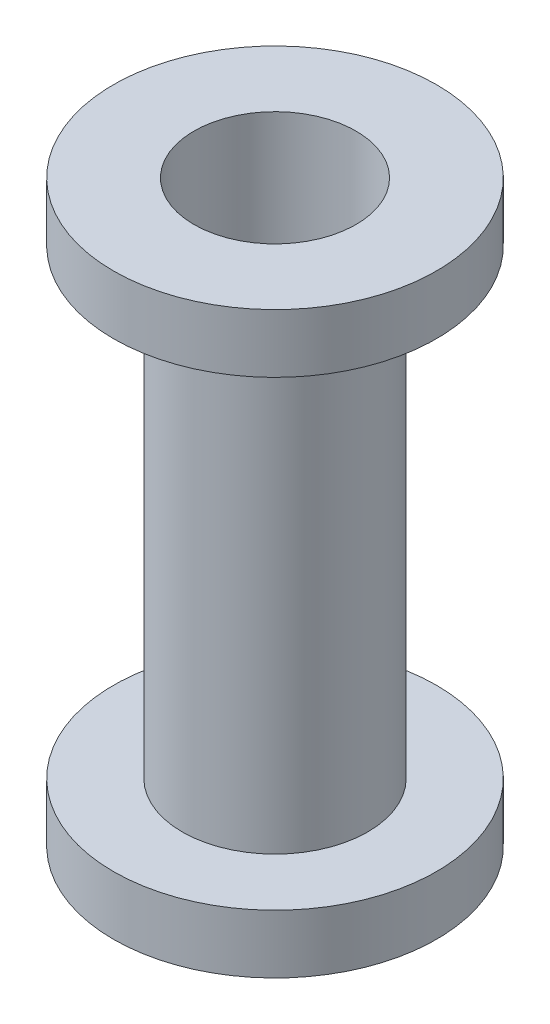
ISO-10303-21;
HEADER;
FILE_DESCRIPTION(('STEP AP214'),'2;1');
FILE_NAME('part.step','',(''),(''),'','','');
FILE_SCHEMA(('AUTOMOTIVE_DESIGN { 1 0 10303 214 1 1 1 1 }'));
ENDSEC;
DATA;
#1=APPLICATION_CONTEXT('core data for automotive mechanical design processes');
#2=APPLICATION_PROTOCOL_DEFINITION('international standard','automotive_design',2000,#1);
#3=PRODUCT_CONTEXT('',#1,'mechanical');
#4=PRODUCT('Part','Part','',(#3));
#5=PRODUCT_RELATED_PRODUCT_CATEGORY('part','',(#4));
#6=PRODUCT_DEFINITION_FORMATION('','',#4);
#7=PRODUCT_DEFINITION_CONTEXT('part definition',#1,'design');
#8=PRODUCT_DEFINITION('design','',#6,#7);
#9=PRODUCT_DEFINITION_SHAPE('','',#8);
#10=(LENGTH_UNIT() NAMED_UNIT(*) SI_UNIT(.MILLI.,.METRE.));
#11=(NAMED_UNIT(*) PLANE_ANGLE_UNIT() SI_UNIT($,.RADIAN.));
#12=(NAMED_UNIT(*) SI_UNIT($,.STERADIAN.) SOLID_ANGLE_UNIT());
#13=UNCERTAINTY_MEASURE_WITH_UNIT(LENGTH_MEASURE(1.E-05),#10,'distance_accuracy_value','');
#14=(GEOMETRIC_REPRESENTATION_CONTEXT(3) GLOBAL_UNCERTAINTY_ASSIGNED_CONTEXT((#13)) GLOBAL_UNIT_ASSIGNED_CONTEXT((#10,
#11,#12)) REPRESENTATION_CONTEXT('',''));
#15=CARTESIAN_POINT('',(0.,0.,0.));
#16=DIRECTION('',(0.,0.,1.));
#17=DIRECTION('',(1.,0.,0.));
#18=AXIS2_PLACEMENT_3D('',#15,#16,#17);
#19=CARTESIAN_POINT('',(0.,125.222,0.));
#20=DIRECTION('',(0.,-1.,0.));
#21=DIRECTION('',(0.,0.,-1.));
#22=AXIS2_PLACEMENT_3D('',#19,#20,#21);
#23=CYLINDRICAL_SURFACE('',#22,20.066);
#24=CARTESIAN_POINT('',(0.,112.522,0.));
#25=DIRECTION('',(0.,1.,0.));
#26=DIRECTION('',(0.,0.,1.));
#27=AXIS2_PLACEMENT_3D('',#24,#25,#26);
#28=CIRCLE('',#27,20.066);
#29=CARTESIAN_POINT('',(0.,112.522,20.066));
#30=VERTEX_POINT('',#29);
#31=EDGE_CURVE('E35',#30,#30,#28,.T.);
#32=ORIENTED_EDGE('',*,*,#31,.F.);
#33=EDGE_LOOP('',(#32));
#34=FACE_BOUND('',#33,.T.);
#35=CARTESIAN_POINT('',(0.,12.7,0.));
#36=DIRECTION('',(0.,-1.,0.));
#37=DIRECTION('',(0.,0.,-1.));
#38=AXIS2_PLACEMENT_3D('',#35,#36,#37);
#39=CIRCLE('',#38,20.066);
#40=CARTESIAN_POINT('',(0.,12.7,-20.066));
#41=VERTEX_POINT('',#40);
#42=EDGE_CURVE('E10',#41,#41,#39,.T.);
#43=ORIENTED_EDGE('',*,*,#42,.F.);
#44=EDGE_LOOP('',(#43));
#45=FACE_BOUND('',#44,.T.);
#46=ADVANCED_FACE('F28',(#34,#45),#23,.T.);
#47=CARTESIAN_POINT('',(0.,125.222,0.));
#48=DIRECTION('',(0.,1.,0.));
#49=DIRECTION('',(0.,0.,1.));
#50=AXIS2_PLACEMENT_3D('',#47,#48,#49);
#51=PLANE('',#50);
#52=CARTESIAN_POINT('',(0.,125.222,0.));
#53=DIRECTION('',(0.,1.,0.));
#54=DIRECTION('',(0.,0.,1.));
#55=AXIS2_PLACEMENT_3D('',#52,#53,#54);
#56=CIRCLE('',#55,17.526);
#57=CARTESIAN_POINT('',(0.,125.222,17.526));
#58=VERTEX_POINT('',#57);
#59=EDGE_CURVE('E40',#58,#58,#56,.T.);
#60=ORIENTED_EDGE('',*,*,#59,.F.);
#61=EDGE_LOOP('',(#60));
#62=FACE_BOUND('',#61,.T.);
#63=CARTESIAN_POINT('',(0.,125.222,0.));
#64=DIRECTION('',(0.,1.,0.));
#65=DIRECTION('',(0.,0.,1.));
#66=AXIS2_PLACEMENT_3D('',#63,#64,#65);
#67=CIRCLE('',#66,34.925);
#68=CARTESIAN_POINT('',(0.,125.222,34.925));
#69=VERTEX_POINT('',#68);
#70=EDGE_CURVE('E49',#69,#69,#67,.T.);
#71=ORIENTED_EDGE('',*,*,#70,.T.);
#72=EDGE_LOOP('',(#71));
#73=FACE_BOUND('',#72,.T.);
#74=ADVANCED_FACE('F72',(#62,#73),#51,.T.);
#75=CARTESIAN_POINT('',(0.,0.,0.));
#76=DIRECTION('',(0.,1.,0.));
#77=DIRECTION('',(0.,0.,1.));
#78=AXIS2_PLACEMENT_3D('',#75,#76,#77);
#79=PLANE('',#78);
#80=CARTESIAN_POINT('',(0.,0.,0.));
#81=DIRECTION('',(0.,1.,0.));
#82=DIRECTION('',(0.,0.,1.));
#83=AXIS2_PLACEMENT_3D('',#80,#81,#82);
#84=CIRCLE('',#83,17.526);
#85=CARTESIAN_POINT('',(0.,0.,17.526));
#86=VERTEX_POINT('',#85);
#87=EDGE_CURVE('E31',#86,#86,#84,.T.);
#88=ORIENTED_EDGE('',*,*,#87,.T.);
#89=EDGE_LOOP('',(#88));
#90=FACE_BOUND('',#89,.T.);
#91=CARTESIAN_POINT('',(0.,0.,0.));
#92=DIRECTION('',(0.,-1.,0.));
#93=DIRECTION('',(0.,0.,-1.));
#94=AXIS2_PLACEMENT_3D('',#91,#92,#93);
#95=CIRCLE('',#94,34.925);
#96=CARTESIAN_POINT('',(0.,0.,-34.925));
#97=VERTEX_POINT('',#96);
#98=EDGE_CURVE('E44',#97,#97,#95,.T.);
#99=ORIENTED_EDGE('',*,*,#98,.T.);
#100=EDGE_LOOP('',(#99));
#101=FACE_BOUND('',#100,.T.);
#102=ADVANCED_FACE('F58',(#90,#101),#79,.F.);
#103=CARTESIAN_POINT('',(0.,125.222,0.));
#104=DIRECTION('',(0.,-1.,0.));
#105=DIRECTION('',(0.,0.,-1.));
#106=AXIS2_PLACEMENT_3D('',#103,#104,#105);
#107=CYLINDRICAL_SURFACE('',#106,17.526);
#108=ORIENTED_EDGE('',*,*,#87,.F.);
#109=EDGE_LOOP('',(#108));
#110=FACE_BOUND('',#109,.T.);
#111=ORIENTED_EDGE('',*,*,#59,.T.);
#112=EDGE_LOOP('',(#111));
#113=FACE_BOUND('',#112,.T.);
#114=ADVANCED_FACE('F61',(#110,#113),#107,.F.);
#115=CARTESIAN_POINT('',(0.,112.522,0.));
#116=DIRECTION('',(0.,1.,0.));
#117=DIRECTION('',(0.,0.,1.));
#118=AXIS2_PLACEMENT_3D('',#115,#116,#117);
#119=PLANE('',#118);
#120=CARTESIAN_POINT('',(0.,112.522,0.));
#121=DIRECTION('',(0.,1.,0.));
#122=DIRECTION('',(0.,0.,1.));
#123=AXIS2_PLACEMENT_3D('',#120,#121,#122);
#124=CIRCLE('',#123,34.925);
#125=CARTESIAN_POINT('',(0.,112.522,34.925));
#126=VERTEX_POINT('',#125);
#127=EDGE_CURVE('E46',#126,#126,#124,.T.);
#128=ORIENTED_EDGE('',*,*,#127,.F.);
#129=EDGE_LOOP('',(#128));
#130=FACE_BOUND('',#129,.T.);
#131=ORIENTED_EDGE('',*,*,#31,.T.);
#132=EDGE_LOOP('',(#131));
#133=FACE_BOUND('',#132,.T.);
#134=ADVANCED_FACE('F63',(#130,#133),#119,.F.);
#135=CARTESIAN_POINT('',(0.,112.522,0.));
#136=DIRECTION('',(0.,1.,0.));
#137=DIRECTION('',(0.,0.,1.));
#138=AXIS2_PLACEMENT_3D('',#135,#136,#137);
#139=CYLINDRICAL_SURFACE('',#138,34.925);
#140=ORIENTED_EDGE('',*,*,#127,.T.);
#141=EDGE_LOOP('',(#140));
#142=FACE_BOUND('',#141,.T.);
#143=ORIENTED_EDGE('',*,*,#70,.F.);
#144=EDGE_LOOP('',(#143));
#145=FACE_BOUND('',#144,.T.);
#146=ADVANCED_FACE('F69',(#142,#145),#139,.T.);
#147=CARTESIAN_POINT('',(0.,12.7,0.));
#148=DIRECTION('',(0.,-1.,0.));
#149=DIRECTION('',(0.,0.,-1.));
#150=AXIS2_PLACEMENT_3D('',#147,#148,#149);
#151=PLANE('',#150);
#152=CARTESIAN_POINT('',(0.,12.7,0.));
#153=DIRECTION('',(0.,-1.,0.));
#154=DIRECTION('',(0.,0.,-1.));
#155=AXIS2_PLACEMENT_3D('',#152,#153,#154);
#156=CIRCLE('',#155,34.925);
#157=CARTESIAN_POINT('',(0.,12.7,-34.925));
#158=VERTEX_POINT('',#157);
#159=EDGE_CURVE('E51',#158,#158,#156,.T.);
#160=ORIENTED_EDGE('',*,*,#159,.F.);
#161=EDGE_LOOP('',(#160));
#162=FACE_BOUND('',#161,.T.);
#163=ORIENTED_EDGE('',*,*,#42,.T.);
#164=EDGE_LOOP('',(#163));
#165=FACE_BOUND('',#164,.T.);
#166=ADVANCED_FACE('F90',(#162,#165),#151,.F.);
#167=CARTESIAN_POINT('',(0.,12.7,0.));
#168=DIRECTION('',(0.,-1.,0.));
#169=DIRECTION('',(0.,0.,-1.));
#170=AXIS2_PLACEMENT_3D('',#167,#168,#169);
#171=CYLINDRICAL_SURFACE('',#170,34.925);
#172=ORIENTED_EDGE('',*,*,#159,.T.);
#173=EDGE_LOOP('',(#172));
#174=FACE_BOUND('',#173,.T.);
#175=ORIENTED_EDGE('',*,*,#98,.F.);
#176=EDGE_LOOP('',(#175));
#177=FACE_BOUND('',#176,.T.);
#178=ADVANCED_FACE('F95',(#174,#177),#171,.T.);
#179=CLOSED_SHELL('',(#46,#74,#102,#114,#134,#146,#166,#178));
#180=MANIFOLD_SOLID_BREP('B2',#179);
#181=ADVANCED_BREP_SHAPE_REPRESENTATION('',(#18,#180),#14);
#182=SHAPE_DEFINITION_REPRESENTATION(#9,#181);
ENDSEC;
END-ISO-10303-21;
